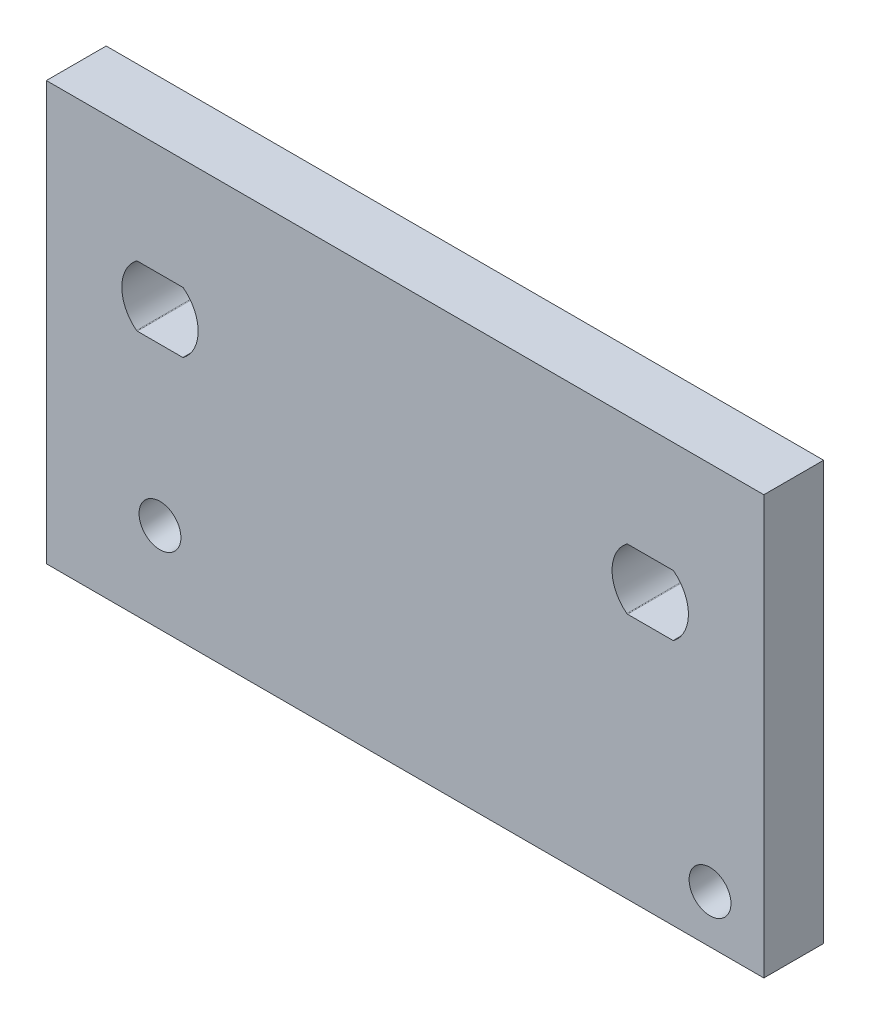
ISO-10303-21;
HEADER;
FILE_DESCRIPTION(('STEP AP214'),'2;1');
FILE_NAME('part.step','',(''),(''),'','','');
FILE_SCHEMA(('AUTOMOTIVE_DESIGN { 1 0 10303 214 1 1 1 1 }'));
ENDSEC;
DATA;
#1=APPLICATION_CONTEXT('core data for automotive mechanical design processes');
#2=APPLICATION_PROTOCOL_DEFINITION('international standard','automotive_design',2000,#1);
#3=PRODUCT_CONTEXT('',#1,'mechanical');
#4=PRODUCT('Part','Part','',(#3));
#5=PRODUCT_RELATED_PRODUCT_CATEGORY('part','',(#4));
#6=PRODUCT_DEFINITION_FORMATION('','',#4);
#7=PRODUCT_DEFINITION_CONTEXT('part definition',#1,'design');
#8=PRODUCT_DEFINITION('design','',#6,#7);
#9=PRODUCT_DEFINITION_SHAPE('','',#8);
#10=(LENGTH_UNIT() NAMED_UNIT(*) SI_UNIT(.MILLI.,.METRE.));
#11=(NAMED_UNIT(*) PLANE_ANGLE_UNIT() SI_UNIT($,.RADIAN.));
#12=(NAMED_UNIT(*) SI_UNIT($,.STERADIAN.) SOLID_ANGLE_UNIT());
#13=UNCERTAINTY_MEASURE_WITH_UNIT(LENGTH_MEASURE(1.E-05),#10,'distance_accuracy_value','');
#14=(GEOMETRIC_REPRESENTATION_CONTEXT(3) GLOBAL_UNCERTAINTY_ASSIGNED_CONTEXT((#13)) GLOBAL_UNIT_ASSIGNED_CONTEXT((#10,
#11,#12)) REPRESENTATION_CONTEXT('',''));
#15=CARTESIAN_POINT('',(0.,0.,0.));
#16=DIRECTION('',(0.,0.,1.));
#17=DIRECTION('',(1.,0.,0.));
#18=AXIS2_PLACEMENT_3D('',#15,#16,#17);
#19=CARTESIAN_POINT('',(-70.,35.,10.));
#20=DIRECTION('',(0.,-1.,0.));
#21=DIRECTION('',(0.,0.,-1.));
#22=AXIS2_PLACEMENT_3D('',#19,#20,#21);
#23=PLANE('',#22);
#24=DIRECTION('',(0.,0.,-1.));
#25=VECTOR('',#24,1.);
#26=CARTESIAN_POINT('',(-60.,35.,10.));
#27=LINE('',#26,#25);
#28=CARTESIAN_POINT('',(-60.,35.,10.));
#29=VERTEX_POINT('',#28);
#30=CARTESIAN_POINT('',(-60.,35.,0.));
#31=VERTEX_POINT('',#30);
#32=EDGE_CURVE('E51',#29,#31,#27,.T.);
#33=ORIENTED_EDGE('',*,*,#32,.F.);
#34=DIRECTION('',(-1.,0.,0.));
#35=VECTOR('',#34,1.);
#36=CARTESIAN_POINT('',(-70.,35.,10.));
#37=LINE('',#36,#35);
#38=CARTESIAN_POINT('',(60.,35.,10.));
#39=VERTEX_POINT('',#38);
#40=EDGE_CURVE('E43',#39,#29,#37,.T.);
#41=ORIENTED_EDGE('',*,*,#40,.F.);
#42=DIRECTION('',(0.,0.,1.));
#43=VECTOR('',#42,1.);
#44=CARTESIAN_POINT('',(60.,35.,0.));
#45=LINE('',#44,#43);
#46=CARTESIAN_POINT('',(60.,35.,0.));
#47=VERTEX_POINT('',#46);
#48=EDGE_CURVE('E211',#47,#39,#45,.T.);
#49=ORIENTED_EDGE('',*,*,#48,.F.);
#50=DIRECTION('',(-1.,0.,0.));
#51=VECTOR('',#50,1.);
#52=CARTESIAN_POINT('',(-70.,35.,0.));
#53=LINE('',#52,#51);
#54=EDGE_CURVE('E186',#47,#31,#53,.T.);
#55=ORIENTED_EDGE('',*,*,#54,.T.);
#56=EDGE_LOOP('',(#33,#41,#49,#55));
#57=FACE_BOUND('',#56,.T.);
#58=ADVANCED_FACE('F35',(#57),#23,.F.);
#59=CARTESIAN_POINT('',(-70.,-35.,10.));
#60=DIRECTION('',(0.,1.,0.));
#61=DIRECTION('',(0.,0.,1.));
#62=AXIS2_PLACEMENT_3D('',#59,#60,#61);
#63=PLANE('',#62);
#64=DIRECTION('',(0.,0.,1.));
#65=VECTOR('',#64,1.);
#66=CARTESIAN_POINT('',(-60.,-35.,0.));
#67=LINE('',#66,#65);
#68=CARTESIAN_POINT('',(-60.,-35.,0.));
#69=VERTEX_POINT('',#68);
#70=CARTESIAN_POINT('',(-60.,-35.,10.));
#71=VERTEX_POINT('',#70);
#72=EDGE_CURVE('E173',#69,#71,#67,.T.);
#73=ORIENTED_EDGE('',*,*,#72,.F.);
#74=DIRECTION('',(1.,0.,0.));
#75=VECTOR('',#74,1.);
#76=CARTESIAN_POINT('',(-70.,-35.,0.));
#77=LINE('',#76,#75);
#78=CARTESIAN_POINT('',(60.,-35.,0.));
#79=VERTEX_POINT('',#78);
#80=EDGE_CURVE('E59',#69,#79,#77,.T.);
#81=ORIENTED_EDGE('',*,*,#80,.T.);
#82=DIRECTION('',(0.,0.,-1.));
#83=VECTOR('',#82,1.);
#84=CARTESIAN_POINT('',(60.,-35.,10.));
#85=LINE('',#84,#83);
#86=CARTESIAN_POINT('',(60.,-35.,10.));
#87=VERTEX_POINT('',#86);
#88=EDGE_CURVE('E208',#87,#79,#85,.T.);
#89=ORIENTED_EDGE('',*,*,#88,.F.);
#90=DIRECTION('',(1.,0.,0.));
#91=VECTOR('',#90,1.);
#92=CARTESIAN_POINT('',(-70.,-35.,10.));
#93=LINE('',#92,#91);
#94=EDGE_CURVE('E11',#71,#87,#93,.T.);
#95=ORIENTED_EDGE('',*,*,#94,.F.);
#96=EDGE_LOOP('',(#73,#81,#89,#95));
#97=FACE_BOUND('',#96,.T.);
#98=ADVANCED_FACE('F180',(#97),#63,.F.);
#99=CARTESIAN_POINT('',(0.,0.,10.));
#100=DIRECTION('',(0.,0.,1.));
#101=DIRECTION('',(1.,0.,0.));
#102=AXIS2_PLACEMENT_3D('',#99,#100,#101);
#103=PLANE('',#102);
#104=CARTESIAN_POINT('',(-41.,-19.9633715287824,10.));
#105=DIRECTION('',(0.,0.,1.));
#106=DIRECTION('',(0.,-1.,0.));
#107=AXIS2_PLACEMENT_3D('',#104,#105,#106);
#108=ELLIPSE('',#107,3.5085466432841,3.5);
#109=CARTESIAN_POINT('',(-41.,-23.4719181720665,10.));
#110=VERTEX_POINT('',#109);
#111=EDGE_CURVE('E195',#110,#110,#108,.T.);
#112=ORIENTED_EDGE('',*,*,#111,.F.);
#113=EDGE_LOOP('',(#112));
#114=FACE_BOUND('',#113,.T.);
#115=CARTESIAN_POINT('',(51.,-26.9804648153506,10.));
#116=DIRECTION('',(0.,0.,1.));
#117=DIRECTION('',(0.,-1.,0.));
#118=AXIS2_PLACEMENT_3D('',#115,#116,#117);
#119=ELLIPSE('',#118,3.5085466432841,3.5);
#120=CARTESIAN_POINT('',(51.,-30.4890114586347,10.));
#121=VERTEX_POINT('',#120);
#122=EDGE_CURVE('E194',#121,#121,#119,.T.);
#123=ORIENTED_EDGE('',*,*,#122,.F.);
#124=EDGE_LOOP('',(#123));
#125=FACE_BOUND('',#124,.T.);
#126=CARTESIAN_POINT('',(44.7993298633435,6.49931990762285,10.));
#127=DIRECTION('',(0.,0.,-1.));
#128=DIRECTION('',(-1.,0.,0.));
#129=AXIS2_PLACEMENT_3D('',#126,#127,#128);
#130=CIRCLE('',#129,0.203199999999999);
#131=CARTESIAN_POINT('',(44.9242108266673,6.33902335432451,10.));
#132=VERTEX_POINT('',#131);
#133=CARTESIAN_POINT('',(44.7993298633435,6.29611990762285,10.));
#134=VERTEX_POINT('',#133);
#135=EDGE_CURVE('E217',#132,#134,#130,.T.);
#136=ORIENTED_EDGE('',*,*,#135,.T.);
#137=DIRECTION('',(-1.,0.,0.));
#138=VECTOR('',#137,1.);
#139=CARTESIAN_POINT('',(44.7993298633435,6.29611990762285,10.));
#140=LINE('',#139,#138);
#141=CARTESIAN_POINT('',(37.2006701366565,6.29611990762284,10.));
#142=VERTEX_POINT('',#141);
#143=EDGE_CURVE('E220',#134,#142,#140,.T.);
#144=ORIENTED_EDGE('',*,*,#143,.T.);
#145=CARTESIAN_POINT('',(37.2006701366565,6.49931990762284,10.));
#146=DIRECTION('',(0.,0.,-1.));
#147=DIRECTION('',(-1.,0.,0.));
#148=AXIS2_PLACEMENT_3D('',#145,#146,#147);
#149=CIRCLE('',#148,0.2032);
#150=CARTESIAN_POINT('',(37.0757891733327,6.33902335432451,10.));
#151=VERTEX_POINT('',#150);
#152=EDGE_CURVE('E224',#142,#151,#149,.T.);
#153=ORIENTED_EDGE('',*,*,#152,.T.);
#154=CARTESIAN_POINT('',(41.,11.3761199076228,10.));
#155=DIRECTION('',(0.,0.,-1.));
#156=DIRECTION('',(-1.,0.,0.));
#157=AXIS2_PLACEMENT_3D('',#154,#155,#156);
#158=CIRCLE('',#157,6.38527777777778);
#159=CARTESIAN_POINT('',(37.0757891733327,16.4132164609212,10.));
#160=VERTEX_POINT('',#159);
#161=EDGE_CURVE('E227',#151,#160,#158,.T.);
#162=ORIENTED_EDGE('',*,*,#161,.T.);
#163=CARTESIAN_POINT('',(37.2006701366565,16.2529199076228,10.));
#164=DIRECTION('',(0.,0.,-1.));
#165=DIRECTION('',(-1.,0.,0.));
#166=AXIS2_PLACEMENT_3D('',#163,#164,#165);
#167=CIRCLE('',#166,0.2032);
#168=CARTESIAN_POINT('',(37.2006701366565,16.4561199076228,10.));
#169=VERTEX_POINT('',#168);
#170=EDGE_CURVE('E230',#160,#169,#167,.T.);
#171=ORIENTED_EDGE('',*,*,#170,.T.);
#172=DIRECTION('',(1.,0.,0.));
#173=VECTOR('',#172,1.);
#174=CARTESIAN_POINT('',(37.2006701366565,16.4561199076228,10.));
#175=LINE('',#174,#173);
#176=CARTESIAN_POINT('',(44.7993298633435,16.4561199076228,10.));
#177=VERTEX_POINT('',#176);
#178=EDGE_CURVE('E233',#169,#177,#175,.T.);
#179=ORIENTED_EDGE('',*,*,#178,.T.);
#180=CARTESIAN_POINT('',(44.7993298633435,16.2529199076229,10.));
#181=DIRECTION('',(0.,0.,-1.));
#182=DIRECTION('',(-1.,0.,0.));
#183=AXIS2_PLACEMENT_3D('',#180,#181,#182);
#184=CIRCLE('',#183,0.2032);
#185=CARTESIAN_POINT('',(44.9242108266673,16.4132164609212,10.));
#186=VERTEX_POINT('',#185);
#187=EDGE_CURVE('E236',#177,#186,#184,.T.);
#188=ORIENTED_EDGE('',*,*,#187,.T.);
#189=CARTESIAN_POINT('',(41.,11.3761199076228,10.));
#190=DIRECTION('',(0.,0.,-1.));
#191=DIRECTION('',(-1.,0.,0.));
#192=AXIS2_PLACEMENT_3D('',#189,#190,#191);
#193=CIRCLE('',#192,6.38527777777778);
#194=EDGE_CURVE('E239',#186,#132,#193,.T.);
#195=ORIENTED_EDGE('',*,*,#194,.T.);
#196=EDGE_LOOP('',(#136,#144,#153,#162,#171,#179,#188,#195));
#197=FACE_BOUND('',#196,.T.);
#198=CARTESIAN_POINT('',(-41.,11.3761199076229,10.));
#199=DIRECTION('',(0.,0.,-1.));
#200=DIRECTION('',(1.,0.,0.));
#201=AXIS2_PLACEMENT_3D('',#198,#199,#200);
#202=CIRCLE('',#201,6.38527777777778);
#203=CARTESIAN_POINT('',(-37.0757891733327,16.4132164609212,10.));
#204=VERTEX_POINT('',#203);
#205=CARTESIAN_POINT('',(-37.0757891733327,6.33902335432452,10.));
#206=VERTEX_POINT('',#205);
#207=EDGE_CURVE('E281',#204,#206,#202,.T.);
#208=ORIENTED_EDGE('',*,*,#207,.T.);
#209=CARTESIAN_POINT('',(-37.2006701366565,6.49931990762285,10.));
#210=DIRECTION('',(0.,0.,-1.));
#211=DIRECTION('',(1.,0.,0.));
#212=AXIS2_PLACEMENT_3D('',#209,#210,#211);
#213=CIRCLE('',#212,0.2032);
#214=CARTESIAN_POINT('',(-37.2006701366565,6.29611990762285,10.));
#215=VERTEX_POINT('',#214);
#216=EDGE_CURVE('E284',#206,#215,#213,.T.);
#217=ORIENTED_EDGE('',*,*,#216,.T.);
#218=DIRECTION('',(-1.,0.,0.));
#219=VECTOR('',#218,1.);
#220=CARTESIAN_POINT('',(-44.7993298633435,6.29611990762286,10.));
#221=LINE('',#220,#219);
#222=CARTESIAN_POINT('',(-44.7993298633435,6.29611990762286,10.));
#223=VERTEX_POINT('',#222);
#224=EDGE_CURVE('E288',#215,#223,#221,.T.);
#225=ORIENTED_EDGE('',*,*,#224,.T.);
#226=CARTESIAN_POINT('',(-44.7993298633435,6.49931990762286,10.));
#227=DIRECTION('',(0.,0.,-1.));
#228=DIRECTION('',(1.,0.,0.));
#229=AXIS2_PLACEMENT_3D('',#226,#227,#228);
#230=CIRCLE('',#229,0.203199999999999);
#231=CARTESIAN_POINT('',(-44.9242108266673,6.33902335432453,10.));
#232=VERTEX_POINT('',#231);
#233=EDGE_CURVE('E291',#223,#232,#230,.T.);
#234=ORIENTED_EDGE('',*,*,#233,.T.);
#235=CARTESIAN_POINT('',(-41.,11.3761199076229,10.));
#236=DIRECTION('',(0.,0.,-1.));
#237=DIRECTION('',(1.,0.,0.));
#238=AXIS2_PLACEMENT_3D('',#235,#236,#237);
#239=CIRCLE('',#238,6.38527777777777);
#240=CARTESIAN_POINT('',(-44.9242108266673,16.4132164609212,10.));
#241=VERTEX_POINT('',#240);
#242=EDGE_CURVE('E294',#232,#241,#239,.T.);
#243=ORIENTED_EDGE('',*,*,#242,.T.);
#244=CARTESIAN_POINT('',(-44.7993298633435,16.2529199076229,10.));
#245=DIRECTION('',(0.,0.,-1.));
#246=DIRECTION('',(1.,0.,0.));
#247=AXIS2_PLACEMENT_3D('',#244,#245,#246);
#248=CIRCLE('',#247,0.2032);
#249=CARTESIAN_POINT('',(-44.7993298633435,16.4561199076229,10.));
#250=VERTEX_POINT('',#249);
#251=EDGE_CURVE('E297',#241,#250,#248,.T.);
#252=ORIENTED_EDGE('',*,*,#251,.T.);
#253=DIRECTION('',(1.,0.,0.));
#254=VECTOR('',#253,1.);
#255=CARTESIAN_POINT('',(-37.2006701366565,16.4561199076229,10.));
#256=LINE('',#255,#254);
#257=CARTESIAN_POINT('',(-37.2006701366565,16.4561199076229,10.));
#258=VERTEX_POINT('',#257);
#259=EDGE_CURVE('E300',#250,#258,#256,.T.);
#260=ORIENTED_EDGE('',*,*,#259,.T.);
#261=CARTESIAN_POINT('',(-37.2006701366565,16.2529199076229,10.));
#262=DIRECTION('',(0.,0.,-1.));
#263=DIRECTION('',(1.,0.,0.));
#264=AXIS2_PLACEMENT_3D('',#261,#262,#263);
#265=CIRCLE('',#264,0.2032);
#266=EDGE_CURVE('E303',#258,#204,#265,.T.);
#267=ORIENTED_EDGE('',*,*,#266,.T.);
#268=EDGE_LOOP('',(#208,#217,#225,#234,#243,#252,#260,#267));
#269=FACE_BOUND('',#268,.T.);
#270=ORIENTED_EDGE('',*,*,#40,.T.);
#271=DIRECTION('',(0.,1.,0.));
#272=VECTOR('',#271,1.);
#273=CARTESIAN_POINT('',(-60.,-35.,10.));
#274=LINE('',#273,#272);
#275=EDGE_CURVE('E181',#71,#29,#274,.T.);
#276=ORIENTED_EDGE('',*,*,#275,.F.);
#277=ORIENTED_EDGE('',*,*,#94,.T.);
#278=DIRECTION('',(0.,-1.,0.));
#279=VECTOR('',#278,1.);
#280=CARTESIAN_POINT('',(60.,35.,10.));
#281=LINE('',#280,#279);
#282=EDGE_CURVE('E213',#39,#87,#281,.T.);
#283=ORIENTED_EDGE('',*,*,#282,.F.);
#284=EDGE_LOOP('',(#270,#276,#277,#283));
#285=FACE_BOUND('',#284,.T.);
#286=ADVANCED_FACE('F359',(#114,#125,#197,#269,#285),#103,.T.);
#287=CARTESIAN_POINT('',(0.,0.,0.));
#288=DIRECTION('',(0.,0.,1.));
#289=DIRECTION('',(1.,0.,0.));
#290=AXIS2_PLACEMENT_3D('',#287,#288,#289);
#291=PLANE('',#290);
#292=CARTESIAN_POINT('',(-41.,-19.2641034093473,0.));
#293=DIRECTION('',(0.,0.,1.));
#294=DIRECTION('',(0.,-1.,0.));
#295=AXIS2_PLACEMENT_3D('',#292,#293,#294);
#296=ELLIPSE('',#295,3.5085466432841,3.5);
#297=CARTESIAN_POINT('',(-41.,-22.7726500526314,0.));
#298=VERTEX_POINT('',#297);
#299=EDGE_CURVE('E38',#298,#298,#296,.T.);
#300=ORIENTED_EDGE('',*,*,#299,.T.);
#301=EDGE_LOOP('',(#300));
#302=FACE_BOUND('',#301,.T.);
#303=CARTESIAN_POINT('',(51.,-26.2811966959155,0.));
#304=DIRECTION('',(0.,0.,1.));
#305=DIRECTION('',(0.,-1.,0.));
#306=AXIS2_PLACEMENT_3D('',#303,#304,#305);
#307=ELLIPSE('',#306,3.5085466432841,3.5);
#308=CARTESIAN_POINT('',(51.,-29.7897433391996,0.));
#309=VERTEX_POINT('',#308);
#310=EDGE_CURVE('E192',#309,#309,#307,.T.);
#311=ORIENTED_EDGE('',*,*,#310,.T.);
#312=EDGE_LOOP('',(#311));
#313=FACE_BOUND('',#312,.T.);
#314=DIRECTION('',(-1.,0.,0.));
#315=VECTOR('',#314,1.);
#316=CARTESIAN_POINT('',(44.7993298633435,6.29611990762285,0.));
#317=LINE('',#316,#315);
#318=CARTESIAN_POINT('',(44.7993298633435,6.29611990762285,0.));
#319=VERTEX_POINT('',#318);
#320=CARTESIAN_POINT('',(37.2006701366565,6.29611990762284,0.));
#321=VERTEX_POINT('',#320);
#322=EDGE_CURVE('E244',#319,#321,#317,.T.);
#323=ORIENTED_EDGE('',*,*,#322,.F.);
#324=CARTESIAN_POINT('',(44.7993298633435,6.49931990762285,0.));
#325=DIRECTION('',(0.,0.,-1.));
#326=DIRECTION('',(-1.,0.,0.));
#327=AXIS2_PLACEMENT_3D('',#324,#325,#326);
#328=CIRCLE('',#327,0.203199999999999);
#329=CARTESIAN_POINT('',(44.9242108266673,6.33902335432451,0.));
#330=VERTEX_POINT('',#329);
#331=EDGE_CURVE('E216',#330,#319,#328,.T.);
#332=ORIENTED_EDGE('',*,*,#331,.F.);
#333=CARTESIAN_POINT('',(41.,11.3761199076228,0.));
#334=DIRECTION('',(0.,0.,-1.));
#335=DIRECTION('',(-1.,0.,0.));
#336=AXIS2_PLACEMENT_3D('',#333,#334,#335);
#337=CIRCLE('',#336,6.38527777777778);
#338=CARTESIAN_POINT('',(44.9242108266673,16.4132164609212,0.));
#339=VERTEX_POINT('',#338);
#340=EDGE_CURVE('E221',#339,#330,#337,.T.);
#341=ORIENTED_EDGE('',*,*,#340,.F.);
#342=CARTESIAN_POINT('',(44.7993298633435,16.2529199076229,0.));
#343=DIRECTION('',(0.,0.,-1.));
#344=DIRECTION('',(-1.,0.,0.));
#345=AXIS2_PLACEMENT_3D('',#342,#343,#344);
#346=CIRCLE('',#345,0.2032);
#347=CARTESIAN_POINT('',(44.7993298633435,16.4561199076228,0.));
#348=VERTEX_POINT('',#347);
#349=EDGE_CURVE('E259',#348,#339,#346,.T.);
#350=ORIENTED_EDGE('',*,*,#349,.F.);
#351=DIRECTION('',(1.,0.,0.));
#352=VECTOR('',#351,1.);
#353=CARTESIAN_POINT('',(37.2006701366565,16.4561199076228,0.));
#354=LINE('',#353,#352);
#355=CARTESIAN_POINT('',(37.2006701366565,16.4561199076228,0.));
#356=VERTEX_POINT('',#355);
#357=EDGE_CURVE('E256',#356,#348,#354,.T.);
#358=ORIENTED_EDGE('',*,*,#357,.F.);
#359=CARTESIAN_POINT('',(37.2006701366565,16.2529199076228,0.));
#360=DIRECTION('',(0.,0.,-1.));
#361=DIRECTION('',(-1.,0.,0.));
#362=AXIS2_PLACEMENT_3D('',#359,#360,#361);
#363=CIRCLE('',#362,0.2032);
#364=CARTESIAN_POINT('',(37.0757891733327,16.4132164609212,0.));
#365=VERTEX_POINT('',#364);
#366=EDGE_CURVE('E253',#365,#356,#363,.T.);
#367=ORIENTED_EDGE('',*,*,#366,.F.);
#368=CARTESIAN_POINT('',(41.,11.3761199076228,0.));
#369=DIRECTION('',(0.,0.,-1.));
#370=DIRECTION('',(-1.,0.,0.));
#371=AXIS2_PLACEMENT_3D('',#368,#369,#370);
#372=CIRCLE('',#371,6.38527777777778);
#373=CARTESIAN_POINT('',(37.0757891733327,6.33902335432451,0.));
#374=VERTEX_POINT('',#373);
#375=EDGE_CURVE('E250',#374,#365,#372,.T.);
#376=ORIENTED_EDGE('',*,*,#375,.F.);
#377=CARTESIAN_POINT('',(37.2006701366565,6.49931990762284,0.));
#378=DIRECTION('',(0.,0.,-1.));
#379=DIRECTION('',(-1.,0.,0.));
#380=AXIS2_PLACEMENT_3D('',#377,#378,#379);
#381=CIRCLE('',#380,0.2032);
#382=EDGE_CURVE('E247',#321,#374,#381,.T.);
#383=ORIENTED_EDGE('',*,*,#382,.F.);
#384=EDGE_LOOP('',(#323,#332,#341,#350,#358,#367,#376,#383));
#385=FACE_BOUND('',#384,.T.);
#386=CARTESIAN_POINT('',(-37.2006701366565,6.49931990762285,0.));
#387=DIRECTION('',(0.,0.,-1.));
#388=DIRECTION('',(1.,0.,0.));
#389=AXIS2_PLACEMENT_3D('',#386,#387,#388);
#390=CIRCLE('',#389,0.2032);
#391=CARTESIAN_POINT('',(-37.0757891733327,6.33902335432452,0.));
#392=VERTEX_POINT('',#391);
#393=CARTESIAN_POINT('',(-37.2006701366565,6.29611990762285,0.));
#394=VERTEX_POINT('',#393);
#395=EDGE_CURVE('E308',#392,#394,#390,.T.);
#396=ORIENTED_EDGE('',*,*,#395,.F.);
#397=CARTESIAN_POINT('',(-41.,11.3761199076229,0.));
#398=DIRECTION('',(0.,0.,-1.));
#399=DIRECTION('',(1.,0.,0.));
#400=AXIS2_PLACEMENT_3D('',#397,#398,#399);
#401=CIRCLE('',#400,6.38527777777778);
#402=CARTESIAN_POINT('',(-37.0757891733327,16.4132164609212,0.));
#403=VERTEX_POINT('',#402);
#404=EDGE_CURVE('E266',#403,#392,#401,.T.);
#405=ORIENTED_EDGE('',*,*,#404,.F.);
#406=CARTESIAN_POINT('',(-37.2006701366565,16.2529199076229,0.));
#407=DIRECTION('',(0.,0.,-1.));
#408=DIRECTION('',(1.,0.,0.));
#409=AXIS2_PLACEMENT_3D('',#406,#407,#408);
#410=CIRCLE('',#409,0.2032);
#411=CARTESIAN_POINT('',(-37.2006701366565,16.4561199076229,0.));
#412=VERTEX_POINT('',#411);
#413=EDGE_CURVE('E285',#412,#403,#410,.T.);
#414=ORIENTED_EDGE('',*,*,#413,.F.);
#415=DIRECTION('',(1.,0.,0.));
#416=VECTOR('',#415,1.);
#417=CARTESIAN_POINT('',(-37.2006701366565,16.4561199076229,0.));
#418=LINE('',#417,#416);
#419=CARTESIAN_POINT('',(-44.7993298633435,16.4561199076229,0.));
#420=VERTEX_POINT('',#419);
#421=EDGE_CURVE('E323',#420,#412,#418,.T.);
#422=ORIENTED_EDGE('',*,*,#421,.F.);
#423=CARTESIAN_POINT('',(-44.7993298633435,16.2529199076229,0.));
#424=DIRECTION('',(0.,0.,-1.));
#425=DIRECTION('',(1.,0.,0.));
#426=AXIS2_PLACEMENT_3D('',#423,#424,#425);
#427=CIRCLE('',#426,0.2032);
#428=CARTESIAN_POINT('',(-44.9242108266673,16.4132164609212,0.));
#429=VERTEX_POINT('',#428);
#430=EDGE_CURVE('E320',#429,#420,#427,.T.);
#431=ORIENTED_EDGE('',*,*,#430,.F.);
#432=CARTESIAN_POINT('',(-41.,11.3761199076229,0.));
#433=DIRECTION('',(0.,0.,-1.));
#434=DIRECTION('',(1.,0.,0.));
#435=AXIS2_PLACEMENT_3D('',#432,#433,#434);
#436=CIRCLE('',#435,6.38527777777777);
#437=CARTESIAN_POINT('',(-44.9242108266673,6.33902335432453,0.));
#438=VERTEX_POINT('',#437);
#439=EDGE_CURVE('E317',#438,#429,#436,.T.);
#440=ORIENTED_EDGE('',*,*,#439,.F.);
#441=CARTESIAN_POINT('',(-44.7993298633435,6.49931990762286,0.));
#442=DIRECTION('',(0.,0.,-1.));
#443=DIRECTION('',(1.,0.,0.));
#444=AXIS2_PLACEMENT_3D('',#441,#442,#443);
#445=CIRCLE('',#444,0.203199999999999);
#446=CARTESIAN_POINT('',(-44.7993298633435,6.29611990762286,0.));
#447=VERTEX_POINT('',#446);
#448=EDGE_CURVE('E314',#447,#438,#445,.T.);
#449=ORIENTED_EDGE('',*,*,#448,.F.);
#450=DIRECTION('',(-1.,0.,0.));
#451=VECTOR('',#450,1.);
#452=CARTESIAN_POINT('',(-44.7993298633435,6.29611990762286,0.));
#453=LINE('',#452,#451);
#454=EDGE_CURVE('E311',#394,#447,#453,.T.);
#455=ORIENTED_EDGE('',*,*,#454,.F.);
#456=EDGE_LOOP('',(#396,#405,#414,#422,#431,#440,#449,#455));
#457=FACE_BOUND('',#456,.T.);
#458=DIRECTION('',(0.,-1.,0.));
#459=VECTOR('',#458,1.);
#460=CARTESIAN_POINT('',(-60.,35.,0.));
#461=LINE('',#460,#459);
#462=EDGE_CURVE('E171',#31,#69,#461,.T.);
#463=ORIENTED_EDGE('',*,*,#462,.F.);
#464=ORIENTED_EDGE('',*,*,#54,.F.);
#465=DIRECTION('',(0.,1.,0.));
#466=VECTOR('',#465,1.);
#467=CARTESIAN_POINT('',(60.,-35.,0.));
#468=LINE('',#467,#466);
#469=EDGE_CURVE('E185',#79,#47,#468,.T.);
#470=ORIENTED_EDGE('',*,*,#469,.F.);
#471=ORIENTED_EDGE('',*,*,#80,.F.);
#472=EDGE_LOOP('',(#463,#464,#470,#471));
#473=FACE_BOUND('',#472,.T.);
#474=ADVANCED_FACE('F184',(#302,#313,#385,#457,#473),#291,.F.);
#475=CARTESIAN_POINT('',(-41.,11.3761199076229,10.));
#476=DIRECTION('',(0.,0.,-1.));
#477=DIRECTION('',(-1.,0.,0.));
#478=AXIS2_PLACEMENT_3D('',#475,#476,#477);
#479=CYLINDRICAL_SURFACE('',#478,6.38527777777778);
#480=ORIENTED_EDGE('',*,*,#404,.T.);
#481=DIRECTION('',(0.,0.,-1.));
#482=VECTOR('',#481,1.);
#483=CARTESIAN_POINT('',(-37.0757891733327,6.33902335432452,10.));
#484=LINE('',#483,#482);
#485=EDGE_CURVE('E306',#206,#392,#484,.T.);
#486=ORIENTED_EDGE('',*,*,#485,.F.);
#487=ORIENTED_EDGE('',*,*,#207,.F.);
#488=DIRECTION('',(0.,0.,-1.));
#489=VECTOR('',#488,1.);
#490=CARTESIAN_POINT('',(-37.0757891733327,16.4132164609212,10.));
#491=LINE('',#490,#489);
#492=EDGE_CURVE('E190',#204,#403,#491,.T.);
#493=ORIENTED_EDGE('',*,*,#492,.T.);
#494=EDGE_LOOP('',(#480,#486,#487,#493));
#495=FACE_BOUND('',#494,.T.);
#496=ADVANCED_FACE('F362',(#495),#479,.F.);
#497=CARTESIAN_POINT('',(-37.2006701366565,16.2529199076229,10.));
#498=DIRECTION('',(0.,0.,-1.));
#499=DIRECTION('',(-1.,0.,0.));
#500=AXIS2_PLACEMENT_3D('',#497,#498,#499);
#501=CYLINDRICAL_SURFACE('',#500,0.2032);
#502=ORIENTED_EDGE('',*,*,#413,.T.);
#503=ORIENTED_EDGE('',*,*,#492,.F.);
#504=ORIENTED_EDGE('',*,*,#266,.F.);
#505=DIRECTION('',(0.,0.,-1.));
#506=VECTOR('',#505,1.);
#507=CARTESIAN_POINT('',(-37.2006701366565,16.4561199076229,10.));
#508=LINE('',#507,#506);
#509=EDGE_CURVE('E329',#258,#412,#508,.T.);
#510=ORIENTED_EDGE('',*,*,#509,.T.);
#511=EDGE_LOOP('',(#502,#503,#504,#510));
#512=FACE_BOUND('',#511,.T.);
#513=ADVANCED_FACE('F364',(#512),#501,.F.);
#514=CARTESIAN_POINT('',(-37.2006701366565,16.4561199076229,10.));
#515=DIRECTION('',(0.,1.,0.));
#516=DIRECTION('',(-1.,0.,0.));
#517=AXIS2_PLACEMENT_3D('',#514,#515,#516);
#518=PLANE('',#517);
#519=ORIENTED_EDGE('',*,*,#421,.T.);
#520=ORIENTED_EDGE('',*,*,#509,.F.);
#521=ORIENTED_EDGE('',*,*,#259,.F.);
#522=DIRECTION('',(0.,0.,-1.));
#523=VECTOR('',#522,1.);
#524=CARTESIAN_POINT('',(-44.7993298633435,16.4561199076229,10.));
#525=LINE('',#524,#523);
#526=EDGE_CURVE('E331',#250,#420,#525,.T.);
#527=ORIENTED_EDGE('',*,*,#526,.T.);
#528=EDGE_LOOP('',(#519,#520,#521,#527));
#529=FACE_BOUND('',#528,.T.);
#530=ADVANCED_FACE('F368',(#529),#518,.F.);
#531=CARTESIAN_POINT('',(-44.7993298633435,16.2529199076229,10.));
#532=DIRECTION('',(0.,0.,-1.));
#533=DIRECTION('',(-1.,0.,0.));
#534=AXIS2_PLACEMENT_3D('',#531,#532,#533);
#535=CYLINDRICAL_SURFACE('',#534,0.2032);
#536=ORIENTED_EDGE('',*,*,#430,.T.);
#537=ORIENTED_EDGE('',*,*,#526,.F.);
#538=ORIENTED_EDGE('',*,*,#251,.F.);
#539=DIRECTION('',(0.,0.,-1.));
#540=VECTOR('',#539,1.);
#541=CARTESIAN_POINT('',(-44.9242108266673,16.4132164609212,10.));
#542=LINE('',#541,#540);
#543=EDGE_CURVE('E333',#241,#429,#542,.T.);
#544=ORIENTED_EDGE('',*,*,#543,.T.);
#545=EDGE_LOOP('',(#536,#537,#538,#544));
#546=FACE_BOUND('',#545,.T.);
#547=ADVANCED_FACE('F372',(#546),#535,.F.);
#548=CARTESIAN_POINT('',(-41.,11.3761199076229,10.));
#549=DIRECTION('',(0.,0.,-1.));
#550=DIRECTION('',(-1.,0.,0.));
#551=AXIS2_PLACEMENT_3D('',#548,#549,#550);
#552=CYLINDRICAL_SURFACE('',#551,6.38527777777777);
#553=ORIENTED_EDGE('',*,*,#439,.T.);
#554=ORIENTED_EDGE('',*,*,#543,.F.);
#555=ORIENTED_EDGE('',*,*,#242,.F.);
#556=DIRECTION('',(0.,0.,-1.));
#557=VECTOR('',#556,1.);
#558=CARTESIAN_POINT('',(-44.9242108266673,6.33902335432453,10.));
#559=LINE('',#558,#557);
#560=EDGE_CURVE('E335',#232,#438,#559,.T.);
#561=ORIENTED_EDGE('',*,*,#560,.T.);
#562=EDGE_LOOP('',(#553,#554,#555,#561));
#563=FACE_BOUND('',#562,.T.);
#564=ADVANCED_FACE('F375',(#563),#552,.F.);
#565=CARTESIAN_POINT('',(-44.7993298633435,6.49931990762286,10.));
#566=DIRECTION('',(0.,0.,-1.));
#567=DIRECTION('',(-1.,0.,0.));
#568=AXIS2_PLACEMENT_3D('',#565,#566,#567);
#569=CYLINDRICAL_SURFACE('',#568,0.203199999999999);
#570=ORIENTED_EDGE('',*,*,#448,.T.);
#571=ORIENTED_EDGE('',*,*,#560,.F.);
#572=ORIENTED_EDGE('',*,*,#233,.F.);
#573=DIRECTION('',(0.,0.,-1.));
#574=VECTOR('',#573,1.);
#575=CARTESIAN_POINT('',(-44.7993298633435,6.29611990762286,10.));
#576=LINE('',#575,#574);
#577=EDGE_CURVE('E337',#223,#447,#576,.T.);
#578=ORIENTED_EDGE('',*,*,#577,.T.);
#579=EDGE_LOOP('',(#570,#571,#572,#578));
#580=FACE_BOUND('',#579,.T.);
#581=ADVANCED_FACE('F377',(#580),#569,.F.);
#582=CARTESIAN_POINT('',(-44.7993298633435,6.29611990762286,10.));
#583=DIRECTION('',(0.,-1.,0.));
#584=DIRECTION('',(1.,0.,0.));
#585=AXIS2_PLACEMENT_3D('',#582,#583,#584);
#586=PLANE('',#585);
#587=ORIENTED_EDGE('',*,*,#454,.T.);
#588=ORIENTED_EDGE('',*,*,#577,.F.);
#589=ORIENTED_EDGE('',*,*,#224,.F.);
#590=DIRECTION('',(0.,0.,-1.));
#591=VECTOR('',#590,1.);
#592=CARTESIAN_POINT('',(-37.2006701366565,6.29611990762285,10.));
#593=LINE('',#592,#591);
#594=EDGE_CURVE('E339',#215,#394,#593,.T.);
#595=ORIENTED_EDGE('',*,*,#594,.T.);
#596=EDGE_LOOP('',(#587,#588,#589,#595));
#597=FACE_BOUND('',#596,.T.);
#598=ADVANCED_FACE('F356',(#597),#586,.F.);
#599=CARTESIAN_POINT('',(-37.2006701366565,6.49931990762285,10.));
#600=DIRECTION('',(0.,0.,-1.));
#601=DIRECTION('',(-1.,0.,0.));
#602=AXIS2_PLACEMENT_3D('',#599,#600,#601);
#603=CYLINDRICAL_SURFACE('',#602,0.2032);
#604=ORIENTED_EDGE('',*,*,#395,.T.);
#605=ORIENTED_EDGE('',*,*,#594,.F.);
#606=ORIENTED_EDGE('',*,*,#216,.F.);
#607=ORIENTED_EDGE('',*,*,#485,.T.);
#608=EDGE_LOOP('',(#604,#605,#606,#607));
#609=FACE_BOUND('',#608,.T.);
#610=ADVANCED_FACE('F345',(#609),#603,.F.);
#611=CARTESIAN_POINT('',(44.7993298633435,6.49931990762285,10.));
#612=DIRECTION('',(0.,0.,-1.));
#613=DIRECTION('',(-1.,0.,0.));
#614=AXIS2_PLACEMENT_3D('',#611,#612,#613);
#615=CYLINDRICAL_SURFACE('',#614,0.203199999999999);
#616=ORIENTED_EDGE('',*,*,#331,.T.);
#617=DIRECTION('',(0.,0.,-1.));
#618=VECTOR('',#617,1.);
#619=CARTESIAN_POINT('',(44.7993298633435,6.29611990762285,10.));
#620=LINE('',#619,#618);
#621=EDGE_CURVE('E242',#134,#319,#620,.T.);
#622=ORIENTED_EDGE('',*,*,#621,.F.);
#623=ORIENTED_EDGE('',*,*,#135,.F.);
#624=DIRECTION('',(0.,0.,-1.));
#625=VECTOR('',#624,1.);
#626=CARTESIAN_POINT('',(44.9242108266673,6.33902335432451,10.));
#627=LINE('',#626,#625);
#628=EDGE_CURVE('E264',#132,#330,#627,.T.);
#629=ORIENTED_EDGE('',*,*,#628,.T.);
#630=EDGE_LOOP('',(#616,#622,#623,#629));
#631=FACE_BOUND('',#630,.T.);
#632=ADVANCED_FACE('F414',(#631),#615,.F.);
#633=CARTESIAN_POINT('',(41.,11.3761199076228,10.));
#634=DIRECTION('',(0.,0.,-1.));
#635=DIRECTION('',(-1.,0.,0.));
#636=AXIS2_PLACEMENT_3D('',#633,#634,#635);
#637=CYLINDRICAL_SURFACE('',#636,6.38527777777778);
#638=ORIENTED_EDGE('',*,*,#340,.T.);
#639=ORIENTED_EDGE('',*,*,#628,.F.);
#640=ORIENTED_EDGE('',*,*,#194,.F.);
#641=DIRECTION('',(0.,0.,-1.));
#642=VECTOR('',#641,1.);
#643=CARTESIAN_POINT('',(44.9242108266673,16.4132164609212,10.));
#644=LINE('',#643,#642);
#645=EDGE_CURVE('E267',#186,#339,#644,.T.);
#646=ORIENTED_EDGE('',*,*,#645,.T.);
#647=EDGE_LOOP('',(#638,#639,#640,#646));
#648=FACE_BOUND('',#647,.T.);
#649=ADVANCED_FACE('F410',(#648),#637,.F.);
#650=CARTESIAN_POINT('',(44.7993298633435,16.2529199076229,10.));
#651=DIRECTION('',(0.,0.,-1.));
#652=DIRECTION('',(-1.,0.,0.));
#653=AXIS2_PLACEMENT_3D('',#650,#651,#652);
#654=CYLINDRICAL_SURFACE('',#653,0.2032);
#655=ORIENTED_EDGE('',*,*,#349,.T.);
#656=ORIENTED_EDGE('',*,*,#645,.F.);
#657=ORIENTED_EDGE('',*,*,#187,.F.);
#658=DIRECTION('',(0.,0.,-1.));
#659=VECTOR('',#658,1.);
#660=CARTESIAN_POINT('',(44.7993298633435,16.4561199076228,10.));
#661=LINE('',#660,#659);
#662=EDGE_CURVE('E269',#177,#348,#661,.T.);
#663=ORIENTED_EDGE('',*,*,#662,.T.);
#664=EDGE_LOOP('',(#655,#656,#657,#663));
#665=FACE_BOUND('',#664,.T.);
#666=ADVANCED_FACE('F413',(#665),#654,.F.);
#667=CARTESIAN_POINT('',(37.2006701366565,16.4561199076228,10.));
#668=DIRECTION('',(0.,1.,0.));
#669=DIRECTION('',(-1.,0.,0.));
#670=AXIS2_PLACEMENT_3D('',#667,#668,#669);
#671=PLANE('',#670);
#672=ORIENTED_EDGE('',*,*,#357,.T.);
#673=ORIENTED_EDGE('',*,*,#662,.F.);
#674=ORIENTED_EDGE('',*,*,#178,.F.);
#675=DIRECTION('',(0.,0.,-1.));
#676=VECTOR('',#675,1.);
#677=CARTESIAN_POINT('',(37.2006701366565,16.4561199076228,10.));
#678=LINE('',#677,#676);
#679=EDGE_CURVE('E271',#169,#356,#678,.T.);
#680=ORIENTED_EDGE('',*,*,#679,.T.);
#681=EDGE_LOOP('',(#672,#673,#674,#680));
#682=FACE_BOUND('',#681,.T.);
#683=ADVANCED_FACE('F418',(#682),#671,.F.);
#684=CARTESIAN_POINT('',(37.2006701366565,16.2529199076228,10.));
#685=DIRECTION('',(0.,0.,-1.));
#686=DIRECTION('',(-1.,0.,0.));
#687=AXIS2_PLACEMENT_3D('',#684,#685,#686);
#688=CYLINDRICAL_SURFACE('',#687,0.2032);
#689=ORIENTED_EDGE('',*,*,#366,.T.);
#690=ORIENTED_EDGE('',*,*,#679,.F.);
#691=ORIENTED_EDGE('',*,*,#170,.F.);
#692=DIRECTION('',(0.,0.,-1.));
#693=VECTOR('',#692,1.);
#694=CARTESIAN_POINT('',(37.0757891733327,16.4132164609212,10.));
#695=LINE('',#694,#693);
#696=EDGE_CURVE('E273',#160,#365,#695,.T.);
#697=ORIENTED_EDGE('',*,*,#696,.T.);
#698=EDGE_LOOP('',(#689,#690,#691,#697));
#699=FACE_BOUND('',#698,.T.);
#700=ADVANCED_FACE('F422',(#699),#688,.F.);
#701=CARTESIAN_POINT('',(41.,11.3761199076228,10.));
#702=DIRECTION('',(0.,0.,-1.));
#703=DIRECTION('',(-1.,0.,0.));
#704=AXIS2_PLACEMENT_3D('',#701,#702,#703);
#705=CYLINDRICAL_SURFACE('',#704,6.38527777777778);
#706=ORIENTED_EDGE('',*,*,#375,.T.);
#707=ORIENTED_EDGE('',*,*,#696,.F.);
#708=ORIENTED_EDGE('',*,*,#161,.F.);
#709=DIRECTION('',(0.,0.,-1.));
#710=VECTOR('',#709,1.);
#711=CARTESIAN_POINT('',(37.0757891733327,6.33902335432451,10.));
#712=LINE('',#711,#710);
#713=EDGE_CURVE('E275',#151,#374,#712,.T.);
#714=ORIENTED_EDGE('',*,*,#713,.T.);
#715=EDGE_LOOP('',(#706,#707,#708,#714));
#716=FACE_BOUND('',#715,.T.);
#717=ADVANCED_FACE('F426',(#716),#705,.F.);
#718=CARTESIAN_POINT('',(37.2006701366565,6.49931990762284,10.));
#719=DIRECTION('',(0.,0.,-1.));
#720=DIRECTION('',(-1.,0.,0.));
#721=AXIS2_PLACEMENT_3D('',#718,#719,#720);
#722=CYLINDRICAL_SURFACE('',#721,0.2032);
#723=ORIENTED_EDGE('',*,*,#382,.T.);
#724=ORIENTED_EDGE('',*,*,#713,.F.);
#725=ORIENTED_EDGE('',*,*,#152,.F.);
#726=DIRECTION('',(0.,0.,-1.));
#727=VECTOR('',#726,1.);
#728=CARTESIAN_POINT('',(37.2006701366565,6.29611990762284,10.));
#729=LINE('',#728,#727);
#730=EDGE_CURVE('E277',#142,#321,#729,.T.);
#731=ORIENTED_EDGE('',*,*,#730,.T.);
#732=EDGE_LOOP('',(#723,#724,#725,#731));
#733=FACE_BOUND('',#732,.T.);
#734=ADVANCED_FACE('F405',(#733),#722,.F.);
#735=CARTESIAN_POINT('',(44.7993298633435,6.29611990762285,10.));
#736=DIRECTION('',(0.,-1.,0.));
#737=DIRECTION('',(1.,0.,0.));
#738=AXIS2_PLACEMENT_3D('',#735,#736,#737);
#739=PLANE('',#738);
#740=ORIENTED_EDGE('',*,*,#322,.T.);
#741=ORIENTED_EDGE('',*,*,#730,.F.);
#742=ORIENTED_EDGE('',*,*,#143,.F.);
#743=ORIENTED_EDGE('',*,*,#621,.T.);
#744=EDGE_LOOP('',(#740,#741,#742,#743));
#745=FACE_BOUND('',#744,.T.);
#746=ADVANCED_FACE('F397',(#745),#739,.F.);
#747=CARTESIAN_POINT('',(60.,0.,0.));
#748=DIRECTION('',(1.,0.,0.));
#749=DIRECTION('',(0.,0.,-1.));
#750=AXIS2_PLACEMENT_3D('',#747,#748,#749);
#751=PLANE('',#750);
#752=ORIENTED_EDGE('',*,*,#88,.T.);
#753=ORIENTED_EDGE('',*,*,#469,.T.);
#754=ORIENTED_EDGE('',*,*,#48,.T.);
#755=ORIENTED_EDGE('',*,*,#282,.T.);
#756=EDGE_LOOP('',(#752,#753,#754,#755));
#757=FACE_BOUND('',#756,.T.);
#758=ADVANCED_FACE('F395',(#757),#751,.T.);
#759=CARTESIAN_POINT('',(-60.,0.,0.));
#760=DIRECTION('',(-1.,0.,0.));
#761=DIRECTION('',(0.,-1.,0.));
#762=AXIS2_PLACEMENT_3D('',#759,#760,#761);
#763=PLANE('',#762);
#764=ORIENTED_EDGE('',*,*,#32,.T.);
#765=ORIENTED_EDGE('',*,*,#462,.T.);
#766=ORIENTED_EDGE('',*,*,#72,.T.);
#767=ORIENTED_EDGE('',*,*,#275,.T.);
#768=EDGE_LOOP('',(#764,#765,#766,#767));
#769=FACE_BOUND('',#768,.T.);
#770=ADVANCED_FACE('F172',(#769),#763,.T.);
#771=CARTESIAN_POINT('',(51.,-25.983004499076,-4.26434708735715));
#772=DIRECTION('',(0.,-0.0697564737441254,0.997564050259824));
#773=DIRECTION('',(0.,-0.997564050259824,-0.0697564737441255));
#774=AXIS2_PLACEMENT_3D('',#771,#772,#773);
#775=CYLINDRICAL_SURFACE('',#774,3.5);
#776=ORIENTED_EDGE('',*,*,#122,.T.);
#777=EDGE_LOOP('',(#776));
#778=FACE_BOUND('',#777,.T.);
#779=ORIENTED_EDGE('',*,*,#310,.F.);
#780=EDGE_LOOP('',(#779));
#781=FACE_BOUND('',#780,.T.);
#782=ADVANCED_FACE('F403',(#778,#781),#775,.F.);
#783=CARTESIAN_POINT('',(-41.,-19.0000561472573,-3.77605177114827));
#784=DIRECTION('',(0.,-0.0697564737441254,0.997564050259824));
#785=DIRECTION('',(0.,-0.997564050259824,-0.0697564737441255));
#786=AXIS2_PLACEMENT_3D('',#783,#784,#785);
#787=CYLINDRICAL_SURFACE('',#786,3.5);
#788=ORIENTED_EDGE('',*,*,#111,.T.);
#789=EDGE_LOOP('',(#788));
#790=FACE_BOUND('',#789,.T.);
#791=ORIENTED_EDGE('',*,*,#299,.F.);
#792=EDGE_LOOP('',(#791));
#793=FACE_BOUND('',#792,.T.);
#794=ADVANCED_FACE('F563',(#790,#793),#787,.F.);
#795=CLOSED_SHELL('',(#58,#98,#286,#474,#496,#513,#530,#547,#564,#581,#598,#610,#632,#649,#666,
#683,#700,#717,#734,#746,#758,#770,#782,#794));
#796=MANIFOLD_SOLID_BREP('B2',#795);
#797=ADVANCED_BREP_SHAPE_REPRESENTATION('',(#18,#796),#14);
#798=SHAPE_DEFINITION_REPRESENTATION(#9,#797);
ENDSEC;
END-ISO-10303-21;
